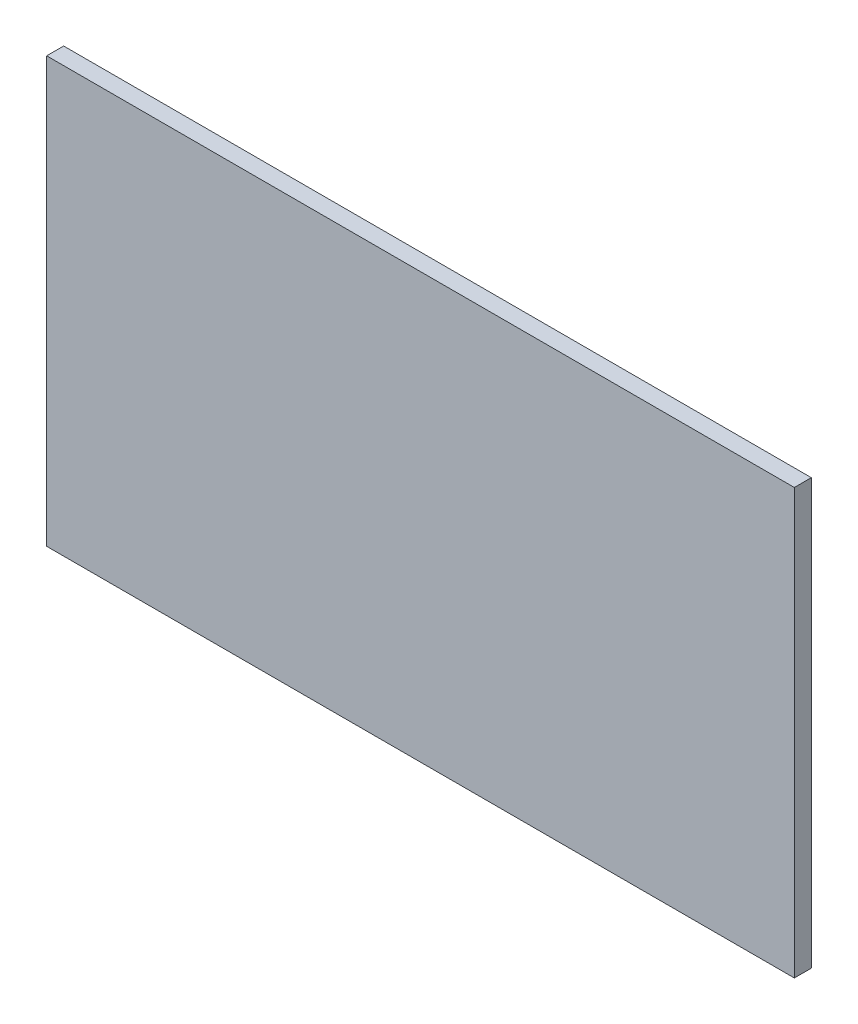
ISO-10303-21;
HEADER;
FILE_DESCRIPTION(('STEP AP214'),'2;1');
FILE_NAME('part.step','',(''),(''),'','','');
FILE_SCHEMA(('AUTOMOTIVE_DESIGN { 1 0 10303 214 1 1 1 1 }'));
ENDSEC;
DATA;
#1=APPLICATION_CONTEXT('core data for automotive mechanical design processes');
#2=APPLICATION_PROTOCOL_DEFINITION('international standard','automotive_design',2000,#1);
#3=PRODUCT_CONTEXT('',#1,'mechanical');
#4=PRODUCT('Part','Part','',(#3));
#5=PRODUCT_RELATED_PRODUCT_CATEGORY('part','',(#4));
#6=PRODUCT_DEFINITION_FORMATION('','',#4);
#7=PRODUCT_DEFINITION_CONTEXT('part definition',#1,'design');
#8=PRODUCT_DEFINITION('design','',#6,#7);
#9=PRODUCT_DEFINITION_SHAPE('','',#8);
#10=(LENGTH_UNIT() NAMED_UNIT(*) SI_UNIT(.MILLI.,.METRE.));
#11=(NAMED_UNIT(*) PLANE_ANGLE_UNIT() SI_UNIT($,.RADIAN.));
#12=(NAMED_UNIT(*) SI_UNIT($,.STERADIAN.) SOLID_ANGLE_UNIT());
#13=UNCERTAINTY_MEASURE_WITH_UNIT(LENGTH_MEASURE(1.E-05),#10,'distance_accuracy_value','');
#14=(GEOMETRIC_REPRESENTATION_CONTEXT(3) GLOBAL_UNCERTAINTY_ASSIGNED_CONTEXT((#13)) GLOBAL_UNIT_ASSIGNED_CONTEXT((#10,
#11,#12)) REPRESENTATION_CONTEXT('',''));
#15=CARTESIAN_POINT('',(0.,0.,0.));
#16=DIRECTION('',(0.,0.,1.));
#17=DIRECTION('',(1.,0.,0.));
#18=AXIS2_PLACEMENT_3D('',#15,#16,#17);
#19=CARTESIAN_POINT('',(0.,0.,20.));
#20=DIRECTION('',(1.,0.,0.));
#21=DIRECTION('',(0.,1.,0.));
#22=AXIS2_PLACEMENT_3D('',#19,#20,#21);
#23=PLANE('',#22);
#24=DIRECTION('',(0.,-1.,0.));
#25=VECTOR('',#24,1.);
#26=CARTESIAN_POINT('',(0.,0.,0.));
#27=LINE('',#26,#25);
#28=CARTESIAN_POINT('',(0.,0.,0.));
#29=VERTEX_POINT('',#28);
#30=CARTESIAN_POINT('',(0.,-500.,0.));
#31=VERTEX_POINT('',#30);
#32=EDGE_CURVE('E102',#29,#31,#27,.T.);
#33=ORIENTED_EDGE('',*,*,#32,.T.);
#34=DIRECTION('',(0.,0.,-1.));
#35=VECTOR('',#34,1.);
#36=CARTESIAN_POINT('',(0.,-500.,20.));
#37=LINE('',#36,#35);
#38=CARTESIAN_POINT('',(0.,-500.,20.));
#39=VERTEX_POINT('',#38);
#40=EDGE_CURVE('E11',#39,#31,#37,.T.);
#41=ORIENTED_EDGE('',*,*,#40,.F.);
#42=DIRECTION('',(0.,-1.,0.));
#43=VECTOR('',#42,1.);
#44=CARTESIAN_POINT('',(0.,0.,20.));
#45=LINE('',#44,#43);
#46=CARTESIAN_POINT('',(0.,0.,20.));
#47=VERTEX_POINT('',#46);
#48=EDGE_CURVE('E90',#47,#39,#45,.T.);
#49=ORIENTED_EDGE('',*,*,#48,.F.);
#50=DIRECTION('',(0.,0.,-1.));
#51=VECTOR('',#50,1.);
#52=CARTESIAN_POINT('',(0.,0.,20.));
#53=LINE('',#52,#51);
#54=EDGE_CURVE('E98',#47,#29,#53,.T.);
#55=ORIENTED_EDGE('',*,*,#54,.T.);
#56=EDGE_LOOP('',(#33,#41,#49,#55));
#57=FACE_BOUND('',#56,.T.);
#58=ADVANCED_FACE('F39',(#57),#23,.F.);
#59=CARTESIAN_POINT('',(0.,-500.,20.));
#60=DIRECTION('',(0.,1.,0.));
#61=DIRECTION('',(0.,0.,1.));
#62=AXIS2_PLACEMENT_3D('',#59,#60,#61);
#63=PLANE('',#62);
#64=DIRECTION('',(1.,0.,0.));
#65=VECTOR('',#64,1.);
#66=CARTESIAN_POINT('',(0.,-500.,0.));
#67=LINE('',#66,#65);
#68=CARTESIAN_POINT('',(880.,-500.,0.));
#69=VERTEX_POINT('',#68);
#70=EDGE_CURVE('E94',#31,#69,#67,.T.);
#71=ORIENTED_EDGE('',*,*,#70,.T.);
#72=DIRECTION('',(0.,0.,-1.));
#73=VECTOR('',#72,1.);
#74=CARTESIAN_POINT('',(880.,-500.,20.));
#75=LINE('',#74,#73);
#76=CARTESIAN_POINT('',(880.,-500.,20.));
#77=VERTEX_POINT('',#76);
#78=EDGE_CURVE('E47',#77,#69,#75,.T.);
#79=ORIENTED_EDGE('',*,*,#78,.F.);
#80=DIRECTION('',(1.,0.,0.));
#81=VECTOR('',#80,1.);
#82=CARTESIAN_POINT('',(0.,-500.,20.));
#83=LINE('',#82,#81);
#84=EDGE_CURVE('E85',#39,#77,#83,.T.);
#85=ORIENTED_EDGE('',*,*,#84,.F.);
#86=ORIENTED_EDGE('',*,*,#40,.T.);
#87=EDGE_LOOP('',(#71,#79,#85,#86));
#88=FACE_BOUND('',#87,.T.);
#89=ADVANCED_FACE('F93',(#88),#63,.F.);
#90=CARTESIAN_POINT('',(880.,0.,20.));
#91=DIRECTION('',(-1.,0.,0.));
#92=DIRECTION('',(0.,-1.,0.));
#93=AXIS2_PLACEMENT_3D('',#90,#91,#92);
#94=PLANE('',#93);
#95=DIRECTION('',(0.,1.,0.));
#96=VECTOR('',#95,1.);
#97=CARTESIAN_POINT('',(880.,0.,0.));
#98=LINE('',#97,#96);
#99=CARTESIAN_POINT('',(880.,0.,0.));
#100=VERTEX_POINT('',#99);
#101=EDGE_CURVE('E72',#69,#100,#98,.T.);
#102=ORIENTED_EDGE('',*,*,#101,.T.);
#103=DIRECTION('',(0.,0.,-1.));
#104=VECTOR('',#103,1.);
#105=CARTESIAN_POINT('',(880.,0.,20.));
#106=LINE('',#105,#104);
#107=CARTESIAN_POINT('',(880.,0.,20.));
#108=VERTEX_POINT('',#107);
#109=EDGE_CURVE('E95',#108,#100,#106,.T.);
#110=ORIENTED_EDGE('',*,*,#109,.F.);
#111=DIRECTION('',(0.,1.,0.));
#112=VECTOR('',#111,1.);
#113=CARTESIAN_POINT('',(880.,0.,20.));
#114=LINE('',#113,#112);
#115=EDGE_CURVE('E88',#77,#108,#114,.T.);
#116=ORIENTED_EDGE('',*,*,#115,.F.);
#117=ORIENTED_EDGE('',*,*,#78,.T.);
#118=EDGE_LOOP('',(#102,#110,#116,#117));
#119=FACE_BOUND('',#118,.T.);
#120=ADVANCED_FACE('F96',(#119),#94,.F.);
#121=CARTESIAN_POINT('',(0.,0.,20.));
#122=DIRECTION('',(0.,-1.,0.));
#123=DIRECTION('',(0.,0.,-1.));
#124=AXIS2_PLACEMENT_3D('',#121,#122,#123);
#125=PLANE('',#124);
#126=DIRECTION('',(-1.,0.,0.));
#127=VECTOR('',#126,1.);
#128=CARTESIAN_POINT('',(0.,0.,0.));
#129=LINE('',#128,#127);
#130=EDGE_CURVE('E78',#100,#29,#129,.T.);
#131=ORIENTED_EDGE('',*,*,#130,.T.);
#132=ORIENTED_EDGE('',*,*,#54,.F.);
#133=DIRECTION('',(-1.,0.,0.));
#134=VECTOR('',#133,1.);
#135=CARTESIAN_POINT('',(0.,0.,20.));
#136=LINE('',#135,#134);
#137=EDGE_CURVE('E55',#108,#47,#136,.T.);
#138=ORIENTED_EDGE('',*,*,#137,.F.);
#139=ORIENTED_EDGE('',*,*,#109,.T.);
#140=EDGE_LOOP('',(#131,#132,#138,#139));
#141=FACE_BOUND('',#140,.T.);
#142=ADVANCED_FACE('F109',(#141),#125,.F.);
#143=CARTESIAN_POINT('',(0.,0.,20.));
#144=DIRECTION('',(0.,0.,1.));
#145=DIRECTION('',(1.,0.,0.));
#146=AXIS2_PLACEMENT_3D('',#143,#144,#145);
#147=PLANE('',#146);
#148=ORIENTED_EDGE('',*,*,#48,.T.);
#149=ORIENTED_EDGE('',*,*,#84,.T.);
#150=ORIENTED_EDGE('',*,*,#115,.T.);
#151=ORIENTED_EDGE('',*,*,#137,.T.);
#152=EDGE_LOOP('',(#148,#149,#150,#151));
#153=FACE_BOUND('',#152,.T.);
#154=ADVANCED_FACE('F86',(#153),#147,.T.);
#155=CARTESIAN_POINT('',(0.,0.,0.));
#156=DIRECTION('',(0.,0.,1.));
#157=DIRECTION('',(1.,0.,0.));
#158=AXIS2_PLACEMENT_3D('',#155,#156,#157);
#159=PLANE('',#158);
#160=ORIENTED_EDGE('',*,*,#32,.F.);
#161=ORIENTED_EDGE('',*,*,#130,.F.);
#162=ORIENTED_EDGE('',*,*,#101,.F.);
#163=ORIENTED_EDGE('',*,*,#70,.F.);
#164=EDGE_LOOP('',(#160,#161,#162,#163));
#165=FACE_BOUND('',#164,.T.);
#166=ADVANCED_FACE('F112',(#165),#159,.F.);
#167=CLOSED_SHELL('',(#58,#89,#120,#142,#154,#166));
#168=MANIFOLD_SOLID_BREP('B2',#167);
#169=ADVANCED_BREP_SHAPE_REPRESENTATION('',(#18,#168),#14);
#170=SHAPE_DEFINITION_REPRESENTATION(#9,#169);
ENDSEC;
END-ISO-10303-21;
